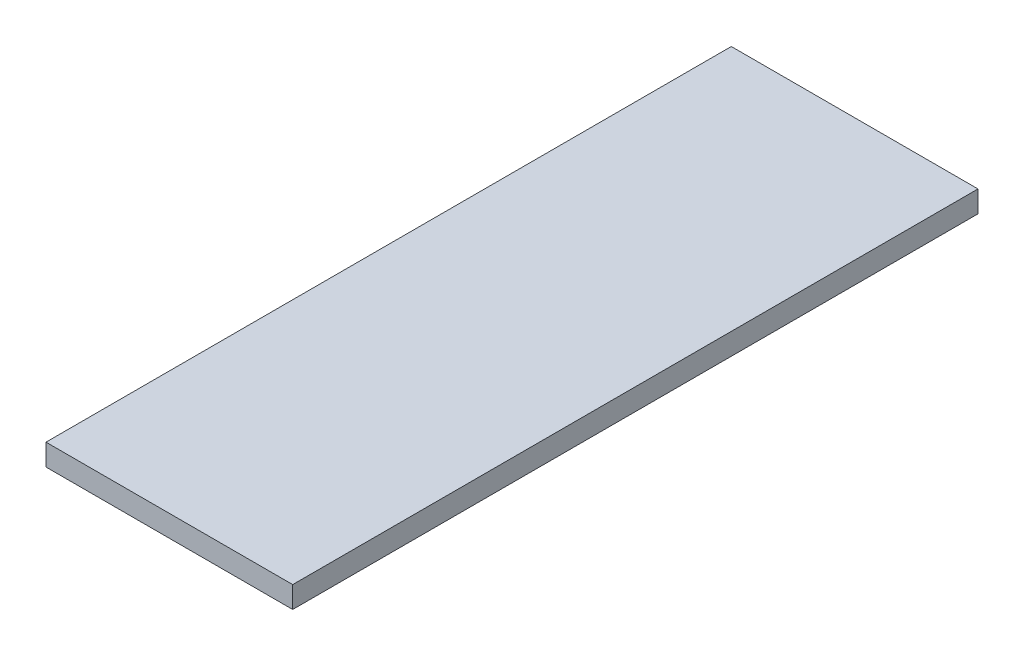
ISO-10303-21;
HEADER;
FILE_DESCRIPTION(('STEP AP214'),'2;1');
FILE_NAME('part.step','',(''),(''),'','','');
FILE_SCHEMA(('AUTOMOTIVE_DESIGN { 1 0 10303 214 1 1 1 1 }'));
ENDSEC;
DATA;
#1=APPLICATION_CONTEXT('core data for automotive mechanical design processes');
#2=APPLICATION_PROTOCOL_DEFINITION('international standard','automotive_design',2000,#1);
#3=PRODUCT_CONTEXT('',#1,'mechanical');
#4=PRODUCT('Part','Part','',(#3));
#5=PRODUCT_RELATED_PRODUCT_CATEGORY('part','',(#4));
#6=PRODUCT_DEFINITION_FORMATION('','',#4);
#7=PRODUCT_DEFINITION_CONTEXT('part definition',#1,'design');
#8=PRODUCT_DEFINITION('design','',#6,#7);
#9=PRODUCT_DEFINITION_SHAPE('','',#8);
#10=(LENGTH_UNIT() NAMED_UNIT(*) SI_UNIT(.MILLI.,.METRE.));
#11=(NAMED_UNIT(*) PLANE_ANGLE_UNIT() SI_UNIT($,.RADIAN.));
#12=(NAMED_UNIT(*) SI_UNIT($,.STERADIAN.) SOLID_ANGLE_UNIT());
#13=UNCERTAINTY_MEASURE_WITH_UNIT(LENGTH_MEASURE(1.E-05),#10,'distance_accuracy_value','');
#14=(GEOMETRIC_REPRESENTATION_CONTEXT(3) GLOBAL_UNCERTAINTY_ASSIGNED_CONTEXT((#13)) GLOBAL_UNIT_ASSIGNED_CONTEXT((#10,
#11,#12)) REPRESENTATION_CONTEXT('',''));
#15=CARTESIAN_POINT('',(0.,0.,0.));
#16=DIRECTION('',(0.,0.,1.));
#17=DIRECTION('',(1.,0.,0.));
#18=AXIS2_PLACEMENT_3D('',#15,#16,#17);
#19=CARTESIAN_POINT('',(-28.575,5.,-79.375));
#20=DIRECTION('',(1.,0.,0.));
#21=DIRECTION('',(0.,0.,-1.));
#22=AXIS2_PLACEMENT_3D('',#19,#20,#21);
#23=PLANE('',#22);
#24=DIRECTION('',(0.,0.,1.));
#25=VECTOR('',#24,1.);
#26=CARTESIAN_POINT('',(-28.575,0.,-79.375));
#27=LINE('',#26,#25);
#28=CARTESIAN_POINT('',(-28.575,0.,-79.375));
#29=VERTEX_POINT('',#28);
#30=CARTESIAN_POINT('',(-28.575,0.,79.375));
#31=VERTEX_POINT('',#30);
#32=EDGE_CURVE('E107',#29,#31,#27,.T.);
#33=ORIENTED_EDGE('',*,*,#32,.T.);
#34=DIRECTION('',(0.,-1.,0.));
#35=VECTOR('',#34,1.);
#36=CARTESIAN_POINT('',(-28.575,5.,79.375));
#37=LINE('',#36,#35);
#38=CARTESIAN_POINT('',(-28.575,5.,79.375));
#39=VERTEX_POINT('',#38);
#40=EDGE_CURVE('E11',#39,#31,#37,.T.);
#41=ORIENTED_EDGE('',*,*,#40,.F.);
#42=DIRECTION('',(0.,0.,1.));
#43=VECTOR('',#42,1.);
#44=CARTESIAN_POINT('',(-28.575,5.,-79.375));
#45=LINE('',#44,#43);
#46=CARTESIAN_POINT('',(-28.575,5.,-79.375));
#47=VERTEX_POINT('',#46);
#48=EDGE_CURVE('E91',#47,#39,#45,.T.);
#49=ORIENTED_EDGE('',*,*,#48,.F.);
#50=DIRECTION('',(0.,-1.,0.));
#51=VECTOR('',#50,1.);
#52=CARTESIAN_POINT('',(-28.575,5.,-79.375));
#53=LINE('',#52,#51);
#54=EDGE_CURVE('E103',#47,#29,#53,.T.);
#55=ORIENTED_EDGE('',*,*,#54,.T.);
#56=EDGE_LOOP('',(#33,#41,#49,#55));
#57=FACE_BOUND('',#56,.T.);
#58=ADVANCED_FACE('F39',(#57),#23,.F.);
#59=CARTESIAN_POINT('',(-28.575,5.,79.375));
#60=DIRECTION('',(0.,0.,-1.));
#61=DIRECTION('',(-1.,0.,0.));
#62=AXIS2_PLACEMENT_3D('',#59,#60,#61);
#63=PLANE('',#62);
#64=DIRECTION('',(1.,0.,0.));
#65=VECTOR('',#64,1.);
#66=CARTESIAN_POINT('',(-28.575,0.,79.375));
#67=LINE('',#66,#65);
#68=CARTESIAN_POINT('',(28.575,0.,79.375));
#69=VERTEX_POINT('',#68);
#70=EDGE_CURVE('E96',#31,#69,#67,.T.);
#71=ORIENTED_EDGE('',*,*,#70,.T.);
#72=DIRECTION('',(0.,-1.,0.));
#73=VECTOR('',#72,1.);
#74=CARTESIAN_POINT('',(28.575,5.,79.375));
#75=LINE('',#74,#73);
#76=CARTESIAN_POINT('',(28.575,5.,79.375));
#77=VERTEX_POINT('',#76);
#78=EDGE_CURVE('E48',#77,#69,#75,.T.);
#79=ORIENTED_EDGE('',*,*,#78,.F.);
#80=DIRECTION('',(1.,0.,0.));
#81=VECTOR('',#80,1.);
#82=CARTESIAN_POINT('',(-28.575,5.,79.375));
#83=LINE('',#82,#81);
#84=EDGE_CURVE('E86',#39,#77,#83,.T.);
#85=ORIENTED_EDGE('',*,*,#84,.F.);
#86=ORIENTED_EDGE('',*,*,#40,.T.);
#87=EDGE_LOOP('',(#71,#79,#85,#86));
#88=FACE_BOUND('',#87,.T.);
#89=ADVANCED_FACE('F95',(#88),#63,.F.);
#90=CARTESIAN_POINT('',(28.575,5.,-79.375));
#91=DIRECTION('',(-1.,0.,0.));
#92=DIRECTION('',(0.,0.,1.));
#93=AXIS2_PLACEMENT_3D('',#90,#91,#92);
#94=PLANE('',#93);
#95=DIRECTION('',(0.,0.,-1.));
#96=VECTOR('',#95,1.);
#97=CARTESIAN_POINT('',(28.575,0.,-79.375));
#98=LINE('',#97,#96);
#99=CARTESIAN_POINT('',(28.575,0.,-79.375));
#100=VERTEX_POINT('',#99);
#101=EDGE_CURVE('E73',#69,#100,#98,.T.);
#102=ORIENTED_EDGE('',*,*,#101,.T.);
#103=DIRECTION('',(0.,-1.,0.));
#104=VECTOR('',#103,1.);
#105=CARTESIAN_POINT('',(28.575,5.,-79.375));
#106=LINE('',#105,#104);
#107=CARTESIAN_POINT('',(28.575,5.,-79.375));
#108=VERTEX_POINT('',#107);
#109=EDGE_CURVE('E98',#108,#100,#106,.T.);
#110=ORIENTED_EDGE('',*,*,#109,.F.);
#111=DIRECTION('',(0.,0.,-1.));
#112=VECTOR('',#111,1.);
#113=CARTESIAN_POINT('',(28.575,5.,-79.375));
#114=LINE('',#113,#112);
#115=EDGE_CURVE('E89',#77,#108,#114,.T.);
#116=ORIENTED_EDGE('',*,*,#115,.F.);
#117=ORIENTED_EDGE('',*,*,#78,.T.);
#118=EDGE_LOOP('',(#102,#110,#116,#117));
#119=FACE_BOUND('',#118,.T.);
#120=ADVANCED_FACE('F99',(#119),#94,.F.);
#121=CARTESIAN_POINT('',(-28.575,5.,-79.375));
#122=DIRECTION('',(0.,0.,1.));
#123=DIRECTION('',(1.,0.,0.));
#124=AXIS2_PLACEMENT_3D('',#121,#122,#123);
#125=PLANE('',#124);
#126=DIRECTION('',(-1.,0.,0.));
#127=VECTOR('',#126,1.);
#128=CARTESIAN_POINT('',(-28.575,0.,-79.375));
#129=LINE('',#128,#127);
#130=EDGE_CURVE('E79',#100,#29,#129,.T.);
#131=ORIENTED_EDGE('',*,*,#130,.T.);
#132=ORIENTED_EDGE('',*,*,#54,.F.);
#133=DIRECTION('',(-1.,0.,0.));
#134=VECTOR('',#133,1.);
#135=CARTESIAN_POINT('',(-28.575,5.,-79.375));
#136=LINE('',#135,#134);
#137=EDGE_CURVE('E56',#108,#47,#136,.T.);
#138=ORIENTED_EDGE('',*,*,#137,.F.);
#139=ORIENTED_EDGE('',*,*,#109,.T.);
#140=EDGE_LOOP('',(#131,#132,#138,#139));
#141=FACE_BOUND('',#140,.T.);
#142=ADVANCED_FACE('F120',(#141),#125,.F.);
#143=CARTESIAN_POINT('',(0.,5.,0.));
#144=DIRECTION('',(0.,1.,0.));
#145=DIRECTION('',(0.,0.,1.));
#146=AXIS2_PLACEMENT_3D('',#143,#144,#145);
#147=PLANE('',#146);
#148=ORIENTED_EDGE('',*,*,#48,.T.);
#149=ORIENTED_EDGE('',*,*,#84,.T.);
#150=ORIENTED_EDGE('',*,*,#115,.T.);
#151=ORIENTED_EDGE('',*,*,#137,.T.);
#152=EDGE_LOOP('',(#148,#149,#150,#151));
#153=FACE_BOUND('',#152,.T.);
#154=ADVANCED_FACE('F87',(#153),#147,.T.);
#155=CARTESIAN_POINT('',(0.,0.,0.));
#156=DIRECTION('',(0.,1.,0.));
#157=DIRECTION('',(0.,0.,1.));
#158=AXIS2_PLACEMENT_3D('',#155,#156,#157);
#159=PLANE('',#158);
#160=ORIENTED_EDGE('',*,*,#32,.F.);
#161=ORIENTED_EDGE('',*,*,#130,.F.);
#162=ORIENTED_EDGE('',*,*,#101,.F.);
#163=ORIENTED_EDGE('',*,*,#70,.F.);
#164=EDGE_LOOP('',(#160,#161,#162,#163));
#165=FACE_BOUND('',#164,.T.);
#166=ADVANCED_FACE('F123',(#165),#159,.F.);
#167=CLOSED_SHELL('',(#58,#89,#120,#142,#154,#166));
#168=MANIFOLD_SOLID_BREP('B2',#167);
#169=ADVANCED_BREP_SHAPE_REPRESENTATION('',(#18,#168),#14);
#170=SHAPE_DEFINITION_REPRESENTATION(#9,#169);
ENDSEC;
END-ISO-10303-21;
